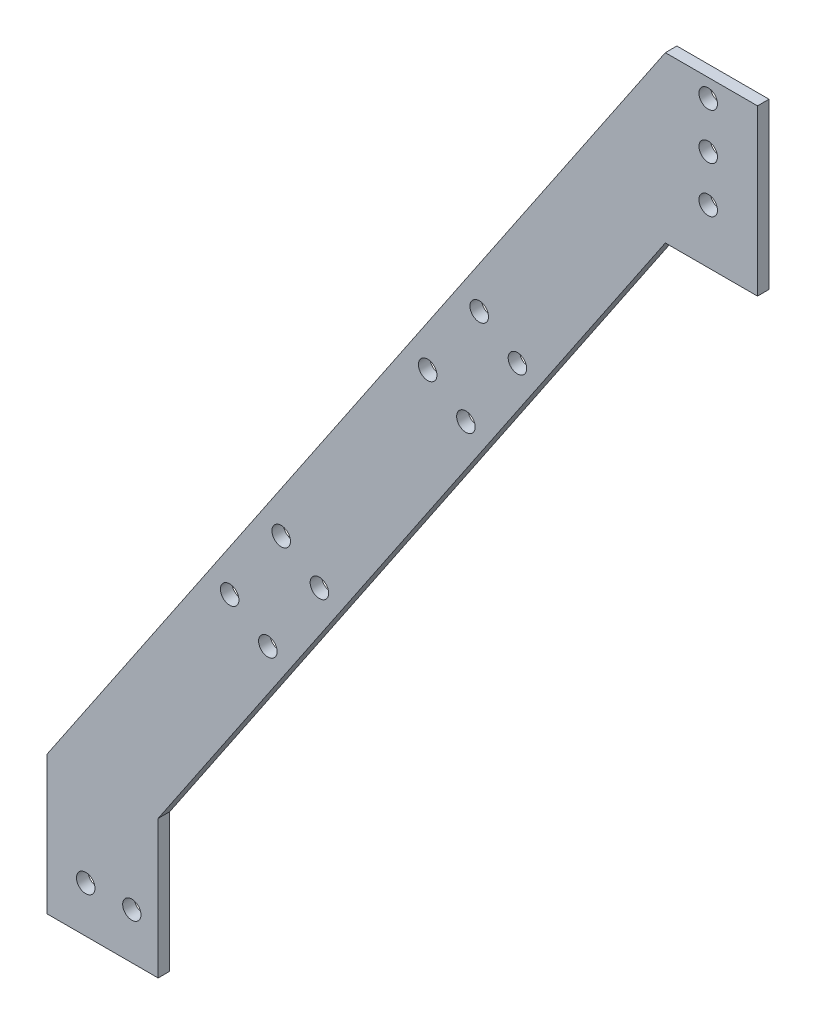
ISO-10303-21;
HEADER;
FILE_DESCRIPTION(('STEP AP214'),'2;1');
FILE_NAME('part.step','',(''),(''),'','','');
FILE_SCHEMA(('AUTOMOTIVE_DESIGN { 1 0 10303 214 1 1 1 1 }'));
ENDSEC;
DATA;
#1=APPLICATION_CONTEXT('core data for automotive mechanical design processes');
#2=APPLICATION_PROTOCOL_DEFINITION('international standard','automotive_design',2000,#1);
#3=PRODUCT_CONTEXT('',#1,'mechanical');
#4=PRODUCT('Part','Part','',(#3));
#5=PRODUCT_RELATED_PRODUCT_CATEGORY('part','',(#4));
#6=PRODUCT_DEFINITION_FORMATION('','',#4);
#7=PRODUCT_DEFINITION_CONTEXT('part definition',#1,'design');
#8=PRODUCT_DEFINITION('design','',#6,#7);
#9=PRODUCT_DEFINITION_SHAPE('','',#8);
#10=(LENGTH_UNIT() NAMED_UNIT(*) SI_UNIT(.MILLI.,.METRE.));
#11=(NAMED_UNIT(*) PLANE_ANGLE_UNIT() SI_UNIT($,.RADIAN.));
#12=(NAMED_UNIT(*) SI_UNIT($,.STERADIAN.) SOLID_ANGLE_UNIT());
#13=UNCERTAINTY_MEASURE_WITH_UNIT(LENGTH_MEASURE(1.E-05),#10,'distance_accuracy_value','');
#14=(GEOMETRIC_REPRESENTATION_CONTEXT(3) GLOBAL_UNCERTAINTY_ASSIGNED_CONTEXT((#13)) GLOBAL_UNIT_ASSIGNED_CONTEXT((#10,
#11,#12)) REPRESENTATION_CONTEXT('',''));
#15=CARTESIAN_POINT('',(0.,0.,0.));
#16=DIRECTION('',(0.,0.,1.));
#17=DIRECTION('',(1.,0.,0.));
#18=AXIS2_PLACEMENT_3D('',#15,#16,#17);
#19=CARTESIAN_POINT('',(30.6379358919992,0.,3.175));
#20=DIRECTION('',(0.,1.,0.));
#21=DIRECTION('',(0.,0.,1.));
#22=AXIS2_PLACEMENT_3D('',#19,#20,#21);
#23=PLANE('',#22);
#24=DIRECTION('',(1.,0.,0.));
#25=VECTOR('',#24,1.);
#26=CARTESIAN_POINT('',(30.6379358919992,0.,0.));
#27=LINE('',#26,#25);
#28=CARTESIAN_POINT('',(0.,0.,0.));
#29=VERTEX_POINT('',#28);
#30=CARTESIAN_POINT('',(30.6379358919992,0.,0.));
#31=VERTEX_POINT('',#30);
#32=EDGE_CURVE('E129',#29,#31,#27,.T.);
#33=ORIENTED_EDGE('',*,*,#32,.T.);
#34=DIRECTION('',(0.,0.,-1.));
#35=VECTOR('',#34,1.);
#36=CARTESIAN_POINT('',(30.6379358919992,0.,3.175));
#37=LINE('',#36,#35);
#38=CARTESIAN_POINT('',(30.6379358919992,0.,3.175));
#39=VERTEX_POINT('',#38);
#40=EDGE_CURVE('E11',#39,#31,#37,.T.);
#41=ORIENTED_EDGE('',*,*,#40,.F.);
#42=DIRECTION('',(1.,0.,0.));
#43=VECTOR('',#42,1.);
#44=CARTESIAN_POINT('',(30.6379358919992,0.,3.175));
#45=LINE('',#44,#43);
#46=CARTESIAN_POINT('',(0.,0.,3.175));
#47=VERTEX_POINT('',#46);
#48=EDGE_CURVE('E144',#47,#39,#45,.T.);
#49=ORIENTED_EDGE('',*,*,#48,.F.);
#50=DIRECTION('',(0.,0.,-1.));
#51=VECTOR('',#50,1.);
#52=CARTESIAN_POINT('',(0.,0.,3.175));
#53=LINE('',#52,#51);
#54=EDGE_CURVE('E125',#47,#29,#53,.T.);
#55=ORIENTED_EDGE('',*,*,#54,.T.);
#56=EDGE_LOOP('',(#33,#41,#49,#55));
#57=FACE_BOUND('',#56,.T.);
#58=ADVANCED_FACE('F33',(#57),#23,.F.);
#59=CARTESIAN_POINT('',(30.6379358919992,38.1,3.175));
#60=DIRECTION('',(-1.,0.,0.));
#61=DIRECTION('',(0.,-1.,0.));
#62=AXIS2_PLACEMENT_3D('',#59,#60,#61);
#63=PLANE('',#62);
#64=DIRECTION('',(0.,1.,0.));
#65=VECTOR('',#64,1.);
#66=CARTESIAN_POINT('',(30.6379358919992,38.1,0.));
#67=LINE('',#66,#65);
#68=CARTESIAN_POINT('',(30.6379358919992,38.1,0.));
#69=VERTEX_POINT('',#68);
#70=EDGE_CURVE('E132',#31,#69,#67,.T.);
#71=ORIENTED_EDGE('',*,*,#70,.T.);
#72=DIRECTION('',(0.,0.,-1.));
#73=VECTOR('',#72,1.);
#74=CARTESIAN_POINT('',(30.6379358919992,38.1,3.175));
#75=LINE('',#74,#73);
#76=CARTESIAN_POINT('',(30.6379358919992,38.1,3.175));
#77=VERTEX_POINT('',#76);
#78=EDGE_CURVE('E41',#77,#69,#75,.T.);
#79=ORIENTED_EDGE('',*,*,#78,.F.);
#80=DIRECTION('',(0.,1.,0.));
#81=VECTOR('',#80,1.);
#82=CARTESIAN_POINT('',(30.6379358919992,38.1,3.175));
#83=LINE('',#82,#81);
#84=EDGE_CURVE('E92',#39,#77,#83,.T.);
#85=ORIENTED_EDGE('',*,*,#84,.F.);
#86=ORIENTED_EDGE('',*,*,#40,.T.);
#87=EDGE_LOOP('',(#71,#79,#85,#86));
#88=FACE_BOUND('',#87,.T.);
#89=ADVANCED_FACE('F303',(#88),#63,.F.);
#90=CARTESIAN_POINT('',(170.441996977884,245.368044205503,3.175));
#91=DIRECTION('',(-0.829037572555041,0.559192903470748,0.));
#92=DIRECTION('',(-0.559192903470748,-0.829037572555041,0.));
#93=AXIS2_PLACEMENT_3D('',#90,#91,#92);
#94=PLANE('',#93);
#95=DIRECTION('',(0.559192903470748,0.829037572555041,0.));
#96=VECTOR('',#95,1.);
#97=CARTESIAN_POINT('',(170.441996977884,245.368044205503,0.));
#98=LINE('',#97,#96);
#99=CARTESIAN_POINT('',(170.441996977884,245.368044205503,0.));
#100=VERTEX_POINT('',#99);
#101=EDGE_CURVE('E135',#69,#100,#98,.T.);
#102=ORIENTED_EDGE('',*,*,#101,.T.);
#103=DIRECTION('',(0.,0.,-1.));
#104=VECTOR('',#103,1.);
#105=CARTESIAN_POINT('',(170.441996977884,245.368044205503,3.175));
#106=LINE('',#105,#104);
#107=CARTESIAN_POINT('',(170.441996977884,245.368044205503,3.175));
#108=VERTEX_POINT('',#107);
#109=EDGE_CURVE('E151',#108,#100,#106,.T.);
#110=ORIENTED_EDGE('',*,*,#109,.F.);
#111=DIRECTION('',(0.559192903470748,0.829037572555041,0.));
#112=VECTOR('',#111,1.);
#113=CARTESIAN_POINT('',(170.441996977884,245.368044205503,3.175));
#114=LINE('',#113,#112);
#115=EDGE_CURVE('E159',#77,#108,#114,.T.);
#116=ORIENTED_EDGE('',*,*,#115,.F.);
#117=ORIENTED_EDGE('',*,*,#78,.T.);
#118=EDGE_LOOP('',(#102,#110,#116,#117));
#119=FACE_BOUND('',#118,.T.);
#120=ADVANCED_FACE('F157',(#119),#94,.F.);
#121=CARTESIAN_POINT('',(195.841996977884,245.368044205503,3.175));
#122=DIRECTION('',(0.,1.,0.));
#123=DIRECTION('',(-1.,0.,0.));
#124=AXIS2_PLACEMENT_3D('',#121,#122,#123);
#125=PLANE('',#124);
#126=DIRECTION('',(1.,0.,0.));
#127=VECTOR('',#126,1.);
#128=CARTESIAN_POINT('',(195.841996977884,245.368044205503,0.));
#129=LINE('',#128,#127);
#130=CARTESIAN_POINT('',(195.841996977884,245.368044205503,0.));
#131=VERTEX_POINT('',#130);
#132=EDGE_CURVE('E137',#100,#131,#129,.T.);
#133=ORIENTED_EDGE('',*,*,#132,.T.);
#134=DIRECTION('',(0.,0.,-1.));
#135=VECTOR('',#134,1.);
#136=CARTESIAN_POINT('',(195.841996977884,245.368044205503,3.175));
#137=LINE('',#136,#135);
#138=CARTESIAN_POINT('',(195.841996977884,245.368044205503,3.175));
#139=VERTEX_POINT('',#138);
#140=EDGE_CURVE('E148',#139,#131,#137,.T.);
#141=ORIENTED_EDGE('',*,*,#140,.F.);
#142=DIRECTION('',(1.,0.,0.));
#143=VECTOR('',#142,1.);
#144=CARTESIAN_POINT('',(195.841996977884,245.368044205503,3.175));
#145=LINE('',#144,#143);
#146=EDGE_CURVE('E171',#108,#139,#145,.T.);
#147=ORIENTED_EDGE('',*,*,#146,.F.);
#148=ORIENTED_EDGE('',*,*,#109,.T.);
#149=EDGE_LOOP('',(#133,#141,#147,#148));
#150=FACE_BOUND('',#149,.T.);
#151=ADVANCED_FACE('F167',(#150),#125,.F.);
#152=CARTESIAN_POINT('',(195.841996977884,290.790652114777,3.175));
#153=DIRECTION('',(-1.,0.,0.));
#154=DIRECTION('',(0.,0.,1.));
#155=AXIS2_PLACEMENT_3D('',#152,#153,#154);
#156=PLANE('',#155);
#157=DIRECTION('',(0.,1.,0.));
#158=VECTOR('',#157,1.);
#159=CARTESIAN_POINT('',(195.841996977884,290.790652114777,0.));
#160=LINE('',#159,#158);
#161=CARTESIAN_POINT('',(195.841996977884,290.790652114777,0.));
#162=VERTEX_POINT('',#161);
#163=EDGE_CURVE('E139',#131,#162,#160,.T.);
#164=ORIENTED_EDGE('',*,*,#163,.T.);
#165=DIRECTION('',(0.,0.,-1.));
#166=VECTOR('',#165,1.);
#167=CARTESIAN_POINT('',(195.841996977884,290.790652114777,3.175));
#168=LINE('',#167,#166);
#169=CARTESIAN_POINT('',(195.841996977884,290.790652114777,3.175));
#170=VERTEX_POINT('',#169);
#171=EDGE_CURVE('E120',#170,#162,#168,.T.);
#172=ORIENTED_EDGE('',*,*,#171,.F.);
#173=DIRECTION('',(0.,1.,0.));
#174=VECTOR('',#173,1.);
#175=CARTESIAN_POINT('',(195.841996977884,290.790652114777,3.175));
#176=LINE('',#175,#174);
#177=EDGE_CURVE('E111',#139,#170,#176,.T.);
#178=ORIENTED_EDGE('',*,*,#177,.F.);
#179=ORIENTED_EDGE('',*,*,#140,.T.);
#180=EDGE_LOOP('',(#164,#172,#178,#179));
#181=FACE_BOUND('',#180,.T.);
#182=ADVANCED_FACE('F170',(#181),#156,.F.);
#183=CARTESIAN_POINT('',(170.441996977884,290.790652114777,3.175));
#184=DIRECTION('',(0.,-1.,0.));
#185=DIRECTION('',(0.,0.,-1.));
#186=AXIS2_PLACEMENT_3D('',#183,#184,#185);
#187=PLANE('',#186);
#188=DIRECTION('',(-1.,0.,0.));
#189=VECTOR('',#188,1.);
#190=CARTESIAN_POINT('',(170.441996977884,290.790652114777,0.));
#191=LINE('',#190,#189);
#192=CARTESIAN_POINT('',(170.441996977884,290.790652114777,0.));
#193=VERTEX_POINT('',#192);
#194=EDGE_CURVE('E119',#162,#193,#191,.T.);
#195=ORIENTED_EDGE('',*,*,#194,.T.);
#196=DIRECTION('',(0.,0.,-1.));
#197=VECTOR('',#196,1.);
#198=CARTESIAN_POINT('',(170.441996977884,290.790652114777,3.175));
#199=LINE('',#198,#197);
#200=CARTESIAN_POINT('',(170.441996977884,290.790652114777,3.175));
#201=VERTEX_POINT('',#200);
#202=EDGE_CURVE('E116',#201,#193,#199,.T.);
#203=ORIENTED_EDGE('',*,*,#202,.F.);
#204=DIRECTION('',(-1.,0.,0.));
#205=VECTOR('',#204,1.);
#206=CARTESIAN_POINT('',(170.441996977884,290.790652114777,3.175));
#207=LINE('',#206,#205);
#208=EDGE_CURVE('E105',#170,#201,#207,.T.);
#209=ORIENTED_EDGE('',*,*,#208,.F.);
#210=ORIENTED_EDGE('',*,*,#171,.T.);
#211=EDGE_LOOP('',(#195,#203,#209,#210));
#212=FACE_BOUND('',#211,.T.);
#213=ADVANCED_FACE('F117',(#212),#187,.F.);
#214=CARTESIAN_POINT('',(0.,38.1,3.175));
#215=DIRECTION('',(0.829037572555041,-0.559192903470748,0.));
#216=DIRECTION('',(0.559192903470748,0.829037572555041,0.));
#217=AXIS2_PLACEMENT_3D('',#214,#215,#216);
#218=PLANE('',#217);
#219=DIRECTION('',(-0.559192903470748,-0.829037572555041,0.));
#220=VECTOR('',#219,1.);
#221=CARTESIAN_POINT('',(0.,38.1,0.));
#222=LINE('',#221,#220);
#223=CARTESIAN_POINT('',(0.,38.1,0.));
#224=VERTEX_POINT('',#223);
#225=EDGE_CURVE('E78',#193,#224,#222,.T.);
#226=ORIENTED_EDGE('',*,*,#225,.T.);
#227=DIRECTION('',(0.,0.,-1.));
#228=VECTOR('',#227,1.);
#229=CARTESIAN_POINT('',(0.,38.1,3.175));
#230=LINE('',#229,#228);
#231=CARTESIAN_POINT('',(0.,38.1,3.175));
#232=VERTEX_POINT('',#231);
#233=EDGE_CURVE('E121',#232,#224,#230,.T.);
#234=ORIENTED_EDGE('',*,*,#233,.F.);
#235=DIRECTION('',(-0.559192903470748,-0.829037572555041,0.));
#236=VECTOR('',#235,1.);
#237=CARTESIAN_POINT('',(0.,38.1,3.175));
#238=LINE('',#237,#236);
#239=EDGE_CURVE('E109',#201,#232,#238,.T.);
#240=ORIENTED_EDGE('',*,*,#239,.F.);
#241=ORIENTED_EDGE('',*,*,#202,.T.);
#242=EDGE_LOOP('',(#226,#234,#240,#241));
#243=FACE_BOUND('',#242,.T.);
#244=ADVANCED_FACE('F123',(#243),#218,.F.);
#245=CARTESIAN_POINT('',(0.,0.,3.175));
#246=DIRECTION('',(1.,0.,0.));
#247=DIRECTION('',(0.,0.,-1.));
#248=AXIS2_PLACEMENT_3D('',#245,#246,#247);
#249=PLANE('',#248);
#250=DIRECTION('',(0.,-1.,0.));
#251=VECTOR('',#250,1.);
#252=CARTESIAN_POINT('',(0.,0.,0.));
#253=LINE('',#252,#251);
#254=EDGE_CURVE('E84',#224,#29,#253,.T.);
#255=ORIENTED_EDGE('',*,*,#254,.T.);
#256=ORIENTED_EDGE('',*,*,#54,.F.);
#257=DIRECTION('',(0.,-1.,0.));
#258=VECTOR('',#257,1.);
#259=CARTESIAN_POINT('',(0.,0.,3.175));
#260=LINE('',#259,#258);
#261=EDGE_CURVE('E49',#232,#47,#260,.T.);
#262=ORIENTED_EDGE('',*,*,#261,.F.);
#263=ORIENTED_EDGE('',*,*,#233,.T.);
#264=EDGE_LOOP('',(#255,#256,#262,#263));
#265=FACE_BOUND('',#264,.T.);
#266=ADVANCED_FACE('F267',(#265),#249,.F.);
#267=CARTESIAN_POINT('',(0.,0.,3.175));
#268=DIRECTION('',(0.,0.,-1.));
#269=DIRECTION('',(-1.,0.,0.));
#270=AXIS2_PLACEMENT_3D('',#267,#268,#269);
#271=PLANE('',#270);
#272=CARTESIAN_POINT('',(129.668859021767,196.275033285297,3.175));
#273=DIRECTION('',(0.,0.,1.));
#274=DIRECTION('',(1.,0.,0.));
#275=AXIS2_PLACEMENT_3D('',#272,#273,#274);
#276=CIRCLE('',#275,2.55269999999999);
#277=CARTESIAN_POINT('',(132.221559021767,196.275033285297,3.175));
#278=VERTEX_POINT('',#277);
#279=EDGE_CURVE('E232',#278,#278,#276,.T.);
#280=ORIENTED_EDGE('',*,*,#279,.F.);
#281=EDGE_LOOP('',(#280));
#282=FACE_BOUND('',#281,.T.);
#283=CARTESIAN_POINT('',(119.140081850318,203.376783159376,3.175));
#284=DIRECTION('',(0.,0.,1.));
#285=DIRECTION('',(1.,0.,0.));
#286=AXIS2_PLACEMENT_3D('',#283,#284,#285);
#287=CIRCLE('',#286,2.55270000000003);
#288=CARTESIAN_POINT('',(121.692781850318,203.376783159376,3.175));
#289=VERTEX_POINT('',#288);
#290=EDGE_CURVE('E226',#289,#289,#287,.T.);
#291=ORIENTED_EDGE('',*,*,#290,.F.);
#292=EDGE_LOOP('',(#291));
#293=FACE_BOUND('',#292,.T.);
#294=CARTESIAN_POINT('',(115.46535927361,175.217478942399,3.175));
#295=DIRECTION('',(0.,0.,1.));
#296=DIRECTION('',(1.,0.,0.));
#297=AXIS2_PLACEMENT_3D('',#294,#295,#296);
#298=CIRCLE('',#297,2.55270000000003);
#299=CARTESIAN_POINT('',(118.01805927361,175.217478942399,3.175));
#300=VERTEX_POINT('',#299);
#301=EDGE_CURVE('E220',#300,#300,#298,.T.);
#302=ORIENTED_EDGE('',*,*,#301,.F.);
#303=EDGE_LOOP('',(#302));
#304=FACE_BOUND('',#303,.T.);
#305=CARTESIAN_POINT('',(50.3535195052181,101.396510668363,3.175));
#306=DIRECTION('',(0.,0.,1.));
#307=DIRECTION('',(1.,0.,0.));
#308=AXIS2_PLACEMENT_3D('',#305,#306,#307);
#309=CIRCLE('',#308,2.5527);
#310=CARTESIAN_POINT('',(52.9062195052181,101.396510668363,3.175));
#311=VERTEX_POINT('',#310);
#312=EDGE_CURVE('E213',#311,#311,#309,.T.);
#313=ORIENTED_EDGE('',*,*,#312,.F.);
#314=EDGE_LOOP('',(#313));
#315=FACE_BOUND('',#314,.T.);
#316=CARTESIAN_POINT('',(64.5570192533751,122.454065011261,3.175));
#317=DIRECTION('',(0.,0.,1.));
#318=DIRECTION('',(1.,0.,0.));
#319=AXIS2_PLACEMENT_3D('',#316,#317,#318);
#320=CIRCLE('',#319,2.5527);
#321=CARTESIAN_POINT('',(67.1097192533751,122.454065011261,3.175));
#322=VERTEX_POINT('',#321);
#323=EDGE_CURVE('E249',#322,#322,#320,.T.);
#324=ORIENTED_EDGE('',*,*,#323,.F.);
#325=EDGE_LOOP('',(#324));
#326=FACE_BOUND('',#325,.T.);
#327=CARTESIAN_POINT('',(75.0857964248241,115.352315137182,3.175));
#328=DIRECTION('',(0.,0.,1.));
#329=DIRECTION('',(1.,0.,0.));
#330=AXIS2_PLACEMENT_3D('',#327,#328,#329);
#331=CIRCLE('',#330,2.55270000000003);
#332=CARTESIAN_POINT('',(77.6384964248242,115.352315137182,3.175));
#333=VERTEX_POINT('',#332);
#334=EDGE_CURVE('E243',#333,#333,#331,.T.);
#335=ORIENTED_EDGE('',*,*,#334,.F.);
#336=EDGE_LOOP('',(#335));
#337=FACE_BOUND('',#336,.T.);
#338=CARTESIAN_POINT('',(60.8822966766672,94.2947607942844,3.175));
#339=DIRECTION('',(0.,0.,1.));
#340=DIRECTION('',(1.,0.,0.));
#341=AXIS2_PLACEMENT_3D('',#338,#339,#340);
#342=CIRCLE('',#341,2.5527);
#343=CARTESIAN_POINT('',(63.4349966766671,94.2947607942844,3.175));
#344=VERTEX_POINT('',#343);
#345=EDGE_CURVE('E237',#344,#344,#342,.T.);
#346=ORIENTED_EDGE('',*,*,#345,.F.);
#347=EDGE_LOOP('',(#346));
#348=FACE_BOUND('',#347,.T.);
#349=CARTESIAN_POINT('',(104.936582102161,182.319228816478,3.175));
#350=DIRECTION('',(0.,0.,1.));
#351=DIRECTION('',(1.,0.,0.));
#352=AXIS2_PLACEMENT_3D('',#349,#350,#351);
#353=CIRCLE('',#352,2.55270000000003);
#354=CARTESIAN_POINT('',(107.489282102161,182.319228816478,3.175));
#355=VERTEX_POINT('',#354);
#356=EDGE_CURVE('E207',#355,#355,#353,.T.);
#357=ORIENTED_EDGE('',*,*,#356,.F.);
#358=EDGE_LOOP('',(#357));
#359=FACE_BOUND('',#358,.T.);
#360=CARTESIAN_POINT('',(182.257063517884,285.750000016777,3.175));
#361=DIRECTION('',(0.,0.,1.));
#362=DIRECTION('',(1.,0.,0.));
#363=AXIS2_PLACEMENT_3D('',#360,#361,#362);
#364=CIRCLE('',#363,2.55269999999998);
#365=CARTESIAN_POINT('',(184.809763517884,285.750000016777,3.175));
#366=VERTEX_POINT('',#365);
#367=EDGE_CURVE('E190',#366,#366,#364,.T.);
#368=ORIENTED_EDGE('',*,*,#367,.F.);
#369=EDGE_LOOP('',(#368));
#370=FACE_BOUND('',#369,.T.);
#371=CARTESIAN_POINT('',(182.257063517884,260.350000016777,3.175));
#372=DIRECTION('',(0.,0.,1.));
#373=DIRECTION('',(1.,0.,0.));
#374=AXIS2_PLACEMENT_3D('',#371,#372,#373);
#375=CIRCLE('',#374,2.55269999999998);
#376=CARTESIAN_POINT('',(184.809763517884,260.350000016777,3.175));
#377=VERTEX_POINT('',#376);
#378=EDGE_CURVE('E191',#377,#377,#375,.T.);
#379=ORIENTED_EDGE('',*,*,#378,.F.);
#380=EDGE_LOOP('',(#379));
#381=FACE_BOUND('',#380,.T.);
#382=CARTESIAN_POINT('',(10.680063476,12.7,3.175));
#383=DIRECTION('',(0.,0.,1.));
#384=DIRECTION('',(1.,0.,0.));
#385=AXIS2_PLACEMENT_3D('',#382,#383,#384);
#386=CIRCLE('',#385,2.55269999999997);
#387=CARTESIAN_POINT('',(13.232763476,12.7,3.175));
#388=VERTEX_POINT('',#387);
#389=EDGE_CURVE('E198',#388,#388,#386,.T.);
#390=ORIENTED_EDGE('',*,*,#389,.F.);
#391=EDGE_LOOP('',(#390));
#392=FACE_BOUND('',#391,.T.);
#393=CARTESIAN_POINT('',(23.380063476,12.7,3.175));
#394=DIRECTION('',(0.,0.,1.));
#395=DIRECTION('',(1.,0.,0.));
#396=AXIS2_PLACEMENT_3D('',#393,#394,#395);
#397=CIRCLE('',#396,2.5223589264469);
#398=CARTESIAN_POINT('',(25.9024224024469,12.7,3.175));
#399=VERTEX_POINT('',#398);
#400=EDGE_CURVE('E177',#399,#399,#397,.T.);
#401=ORIENTED_EDGE('',*,*,#400,.F.);
#402=EDGE_LOOP('',(#401));
#403=FACE_BOUND('',#402,.T.);
#404=CARTESIAN_POINT('',(182.257063517884,273.050000016777,3.175));
#405=DIRECTION('',(0.,0.,1.));
#406=DIRECTION('',(1.,0.,0.));
#407=AXIS2_PLACEMENT_3D('',#404,#405,#406);
#408=CIRCLE('',#407,2.55269999999998);
#409=CARTESIAN_POINT('',(184.809763517884,273.050000016777,3.175));
#410=VERTEX_POINT('',#409);
#411=EDGE_CURVE('E184',#410,#410,#408,.T.);
#412=ORIENTED_EDGE('',*,*,#411,.F.);
#413=EDGE_LOOP('',(#412));
#414=FACE_BOUND('',#413,.T.);
#415=ORIENTED_EDGE('',*,*,#48,.T.);
#416=ORIENTED_EDGE('',*,*,#84,.T.);
#417=ORIENTED_EDGE('',*,*,#115,.T.);
#418=ORIENTED_EDGE('',*,*,#146,.T.);
#419=ORIENTED_EDGE('',*,*,#177,.T.);
#420=ORIENTED_EDGE('',*,*,#208,.T.);
#421=ORIENTED_EDGE('',*,*,#239,.T.);
#422=ORIENTED_EDGE('',*,*,#261,.T.);
#423=EDGE_LOOP('',(#415,#416,#417,#418,#419,#420,#421,#422));
#424=FACE_BOUND('',#423,.T.);
#425=ADVANCED_FACE('F107',(#282,#293,#304,#315,#326,#337,#348,#359,#370,#381,#392,#403,#414,
#424),#271,.F.);
#426=CARTESIAN_POINT('',(0.,0.,0.));
#427=DIRECTION('',(0.,0.,-1.));
#428=DIRECTION('',(-1.,0.,0.));
#429=AXIS2_PLACEMENT_3D('',#426,#427,#428);
#430=PLANE('',#429);
#431=CARTESIAN_POINT('',(129.668859021767,196.275033285297,0.));
#432=DIRECTION('',(0.,0.,1.));
#433=DIRECTION('',(1.,0.,0.));
#434=AXIS2_PLACEMENT_3D('',#431,#432,#433);
#435=CIRCLE('',#434,2.55269999999999);
#436=CARTESIAN_POINT('',(132.221559021767,196.275033285297,0.));
#437=VERTEX_POINT('',#436);
#438=EDGE_CURVE('E210',#437,#437,#435,.T.);
#439=ORIENTED_EDGE('',*,*,#438,.T.);
#440=EDGE_LOOP('',(#439));
#441=FACE_BOUND('',#440,.T.);
#442=CARTESIAN_POINT('',(119.140081850318,203.376783159376,0.));
#443=DIRECTION('',(0.,0.,1.));
#444=DIRECTION('',(1.,0.,0.));
#445=AXIS2_PLACEMENT_3D('',#442,#443,#444);
#446=CIRCLE('',#445,2.55270000000003);
#447=CARTESIAN_POINT('',(121.692781850318,203.376783159376,0.));
#448=VERTEX_POINT('',#447);
#449=EDGE_CURVE('E229',#448,#448,#446,.T.);
#450=ORIENTED_EDGE('',*,*,#449,.T.);
#451=EDGE_LOOP('',(#450));
#452=FACE_BOUND('',#451,.T.);
#453=CARTESIAN_POINT('',(115.46535927361,175.217478942399,0.));
#454=DIRECTION('',(0.,0.,1.));
#455=DIRECTION('',(1.,0.,0.));
#456=AXIS2_PLACEMENT_3D('',#453,#454,#455);
#457=CIRCLE('',#456,2.55270000000003);
#458=CARTESIAN_POINT('',(118.01805927361,175.217478942399,0.));
#459=VERTEX_POINT('',#458);
#460=EDGE_CURVE('E223',#459,#459,#457,.T.);
#461=ORIENTED_EDGE('',*,*,#460,.T.);
#462=EDGE_LOOP('',(#461));
#463=FACE_BOUND('',#462,.T.);
#464=CARTESIAN_POINT('',(50.3535195052181,101.396510668363,0.));
#465=DIRECTION('',(0.,0.,1.));
#466=DIRECTION('',(1.,0.,0.));
#467=AXIS2_PLACEMENT_3D('',#464,#465,#466);
#468=CIRCLE('',#467,2.5527);
#469=CARTESIAN_POINT('',(52.9062195052181,101.396510668363,0.));
#470=VERTEX_POINT('',#469);
#471=EDGE_CURVE('E216',#470,#470,#468,.T.);
#472=ORIENTED_EDGE('',*,*,#471,.T.);
#473=EDGE_LOOP('',(#472));
#474=FACE_BOUND('',#473,.T.);
#475=CARTESIAN_POINT('',(64.5570192533751,122.454065011261,0.));
#476=DIRECTION('',(0.,0.,1.));
#477=DIRECTION('',(1.,0.,0.));
#478=AXIS2_PLACEMENT_3D('',#475,#476,#477);
#479=CIRCLE('',#478,2.5527);
#480=CARTESIAN_POINT('',(67.1097192533751,122.454065011261,0.));
#481=VERTEX_POINT('',#480);
#482=EDGE_CURVE('E217',#481,#481,#479,.T.);
#483=ORIENTED_EDGE('',*,*,#482,.T.);
#484=EDGE_LOOP('',(#483));
#485=FACE_BOUND('',#484,.T.);
#486=CARTESIAN_POINT('',(75.0857964248241,115.352315137182,0.));
#487=DIRECTION('',(0.,0.,1.));
#488=DIRECTION('',(1.,0.,0.));
#489=AXIS2_PLACEMENT_3D('',#486,#487,#488);
#490=CIRCLE('',#489,2.55270000000003);
#491=CARTESIAN_POINT('',(77.6384964248242,115.352315137182,0.));
#492=VERTEX_POINT('',#491);
#493=EDGE_CURVE('E246',#492,#492,#490,.T.);
#494=ORIENTED_EDGE('',*,*,#493,.T.);
#495=EDGE_LOOP('',(#494));
#496=FACE_BOUND('',#495,.T.);
#497=CARTESIAN_POINT('',(60.8822966766672,94.2947607942844,0.));
#498=DIRECTION('',(0.,0.,1.));
#499=DIRECTION('',(1.,0.,0.));
#500=AXIS2_PLACEMENT_3D('',#497,#498,#499);
#501=CIRCLE('',#500,2.5527);
#502=CARTESIAN_POINT('',(63.4349966766671,94.2947607942844,0.));
#503=VERTEX_POINT('',#502);
#504=EDGE_CURVE('E240',#503,#503,#501,.T.);
#505=ORIENTED_EDGE('',*,*,#504,.T.);
#506=EDGE_LOOP('',(#505));
#507=FACE_BOUND('',#506,.T.);
#508=CARTESIAN_POINT('',(104.936582102161,182.319228816478,0.));
#509=DIRECTION('',(0.,0.,1.));
#510=DIRECTION('',(1.,0.,0.));
#511=AXIS2_PLACEMENT_3D('',#508,#509,#510);
#512=CIRCLE('',#511,2.55270000000003);
#513=CARTESIAN_POINT('',(107.489282102161,182.319228816478,0.));
#514=VERTEX_POINT('',#513);
#515=EDGE_CURVE('E195',#514,#514,#512,.T.);
#516=ORIENTED_EDGE('',*,*,#515,.T.);
#517=EDGE_LOOP('',(#516));
#518=FACE_BOUND('',#517,.T.);
#519=CARTESIAN_POINT('',(182.257063517884,285.750000016777,0.));
#520=DIRECTION('',(0.,0.,1.));
#521=DIRECTION('',(1.,0.,0.));
#522=AXIS2_PLACEMENT_3D('',#519,#520,#521);
#523=CIRCLE('',#522,2.55269999999998);
#524=CARTESIAN_POINT('',(184.809763517884,285.750000016777,0.));
#525=VERTEX_POINT('',#524);
#526=EDGE_CURVE('E133',#525,#525,#523,.T.);
#527=ORIENTED_EDGE('',*,*,#526,.T.);
#528=EDGE_LOOP('',(#527));
#529=FACE_BOUND('',#528,.T.);
#530=CARTESIAN_POINT('',(182.257063517884,260.350000016777,0.));
#531=DIRECTION('',(0.,0.,1.));
#532=DIRECTION('',(1.,0.,0.));
#533=AXIS2_PLACEMENT_3D('',#530,#531,#532);
#534=CIRCLE('',#533,2.55269999999998);
#535=CARTESIAN_POINT('',(184.809763517884,260.350000016777,0.));
#536=VERTEX_POINT('',#535);
#537=EDGE_CURVE('E194',#536,#536,#534,.T.);
#538=ORIENTED_EDGE('',*,*,#537,.T.);
#539=EDGE_LOOP('',(#538));
#540=FACE_BOUND('',#539,.T.);
#541=CARTESIAN_POINT('',(10.680063476,12.7,0.));
#542=DIRECTION('',(0.,0.,1.));
#543=DIRECTION('',(1.,0.,0.));
#544=AXIS2_PLACEMENT_3D('',#541,#542,#543);
#545=CIRCLE('',#544,2.55269999999997);
#546=CARTESIAN_POINT('',(13.232763476,12.7,0.));
#547=VERTEX_POINT('',#546);
#548=EDGE_CURVE('E181',#547,#547,#545,.T.);
#549=ORIENTED_EDGE('',*,*,#548,.T.);
#550=EDGE_LOOP('',(#549));
#551=FACE_BOUND('',#550,.T.);
#552=CARTESIAN_POINT('',(23.380063476,12.7,0.));
#553=DIRECTION('',(0.,0.,1.));
#554=DIRECTION('',(1.,0.,0.));
#555=AXIS2_PLACEMENT_3D('',#552,#553,#554);
#556=CIRCLE('',#555,2.5223589264469);
#557=CARTESIAN_POINT('',(25.9024224024469,12.7,0.));
#558=VERTEX_POINT('',#557);
#559=EDGE_CURVE('E180',#558,#558,#556,.T.);
#560=ORIENTED_EDGE('',*,*,#559,.T.);
#561=EDGE_LOOP('',(#560));
#562=FACE_BOUND('',#561,.T.);
#563=CARTESIAN_POINT('',(182.257063517884,273.050000016777,0.));
#564=DIRECTION('',(0.,0.,1.));
#565=DIRECTION('',(1.,0.,0.));
#566=AXIS2_PLACEMENT_3D('',#563,#564,#565);
#567=CIRCLE('',#566,2.55269999999998);
#568=CARTESIAN_POINT('',(184.809763517884,273.050000016777,0.));
#569=VERTEX_POINT('',#568);
#570=EDGE_CURVE('E187',#569,#569,#567,.T.);
#571=ORIENTED_EDGE('',*,*,#570,.T.);
#572=EDGE_LOOP('',(#571));
#573=FACE_BOUND('',#572,.T.);
#574=ORIENTED_EDGE('',*,*,#32,.F.);
#575=ORIENTED_EDGE('',*,*,#254,.F.);
#576=ORIENTED_EDGE('',*,*,#225,.F.);
#577=ORIENTED_EDGE('',*,*,#194,.F.);
#578=ORIENTED_EDGE('',*,*,#163,.F.);
#579=ORIENTED_EDGE('',*,*,#132,.F.);
#580=ORIENTED_EDGE('',*,*,#101,.F.);
#581=ORIENTED_EDGE('',*,*,#70,.F.);
#582=EDGE_LOOP('',(#574,#575,#576,#577,#578,#579,#580,#581));
#583=FACE_BOUND('',#582,.T.);
#584=ADVANCED_FACE('F163',(#441,#452,#463,#474,#485,#496,#507,#518,#529,#540,#551,#562,#573,
#583),#430,.T.);
#585=CARTESIAN_POINT('',(182.257063517884,273.050000016777,0.));
#586=DIRECTION('',(0.,0.,1.));
#587=DIRECTION('',(1.,0.,0.));
#588=AXIS2_PLACEMENT_3D('',#585,#586,#587);
#589=CYLINDRICAL_SURFACE('',#588,2.55269999999998);
#590=ORIENTED_EDGE('',*,*,#570,.F.);
#591=EDGE_LOOP('',(#590));
#592=FACE_BOUND('',#591,.T.);
#593=ORIENTED_EDGE('',*,*,#411,.T.);
#594=EDGE_LOOP('',(#593));
#595=FACE_BOUND('',#594,.T.);
#596=ADVANCED_FACE('F286',(#592,#595),#589,.F.);
#597=CARTESIAN_POINT('',(23.380063476,12.7,0.));
#598=DIRECTION('',(0.,0.,1.));
#599=DIRECTION('',(1.,0.,0.));
#600=AXIS2_PLACEMENT_3D('',#597,#598,#599);
#601=CYLINDRICAL_SURFACE('',#600,2.5223589264469);
#602=ORIENTED_EDGE('',*,*,#559,.F.);
#603=EDGE_LOOP('',(#602));
#604=FACE_BOUND('',#603,.T.);
#605=ORIENTED_EDGE('',*,*,#400,.T.);
#606=EDGE_LOOP('',(#605));
#607=FACE_BOUND('',#606,.T.);
#608=ADVANCED_FACE('F288',(#604,#607),#601,.F.);
#609=CARTESIAN_POINT('',(10.680063476,12.7,0.));
#610=DIRECTION('',(0.,0.,1.));
#611=DIRECTION('',(1.,0.,0.));
#612=AXIS2_PLACEMENT_3D('',#609,#610,#611);
#613=CYLINDRICAL_SURFACE('',#612,2.55269999999997);
#614=ORIENTED_EDGE('',*,*,#548,.F.);
#615=EDGE_LOOP('',(#614));
#616=FACE_BOUND('',#615,.T.);
#617=ORIENTED_EDGE('',*,*,#389,.T.);
#618=EDGE_LOOP('',(#617));
#619=FACE_BOUND('',#618,.T.);
#620=ADVANCED_FACE('F295',(#616,#619),#613,.F.);
#621=CARTESIAN_POINT('',(182.257063517884,260.350000016777,0.));
#622=DIRECTION('',(0.,0.,1.));
#623=DIRECTION('',(1.,0.,0.));
#624=AXIS2_PLACEMENT_3D('',#621,#622,#623);
#625=CYLINDRICAL_SURFACE('',#624,2.55269999999998);
#626=ORIENTED_EDGE('',*,*,#537,.F.);
#627=EDGE_LOOP('',(#626));
#628=FACE_BOUND('',#627,.T.);
#629=ORIENTED_EDGE('',*,*,#378,.T.);
#630=EDGE_LOOP('',(#629));
#631=FACE_BOUND('',#630,.T.);
#632=ADVANCED_FACE('F369',(#628,#631),#625,.F.);
#633=CARTESIAN_POINT('',(182.257063517884,285.750000016777,0.));
#634=DIRECTION('',(0.,0.,1.));
#635=DIRECTION('',(1.,0.,0.));
#636=AXIS2_PLACEMENT_3D('',#633,#634,#635);
#637=CYLINDRICAL_SURFACE('',#636,2.55269999999998);
#638=ORIENTED_EDGE('',*,*,#526,.F.);
#639=EDGE_LOOP('',(#638));
#640=FACE_BOUND('',#639,.T.);
#641=ORIENTED_EDGE('',*,*,#367,.T.);
#642=EDGE_LOOP('',(#641));
#643=FACE_BOUND('',#642,.T.);
#644=ADVANCED_FACE('F379',(#640,#643),#637,.F.);
#645=CARTESIAN_POINT('',(104.936582102161,182.319228816478,0.));
#646=DIRECTION('',(0.,0.,1.));
#647=DIRECTION('',(1.,0.,0.));
#648=AXIS2_PLACEMENT_3D('',#645,#646,#647);
#649=CYLINDRICAL_SURFACE('',#648,2.55270000000003);
#650=ORIENTED_EDGE('',*,*,#515,.F.);
#651=EDGE_LOOP('',(#650));
#652=FACE_BOUND('',#651,.T.);
#653=ORIENTED_EDGE('',*,*,#356,.T.);
#654=EDGE_LOOP('',(#653));
#655=FACE_BOUND('',#654,.T.);
#656=ADVANCED_FACE('F388',(#652,#655),#649,.F.);
#657=CARTESIAN_POINT('',(60.8822966766672,94.2947607942844,0.));
#658=DIRECTION('',(0.,0.,1.));
#659=DIRECTION('',(1.,0.,0.));
#660=AXIS2_PLACEMENT_3D('',#657,#658,#659);
#661=CYLINDRICAL_SURFACE('',#660,2.5527);
#662=ORIENTED_EDGE('',*,*,#504,.F.);
#663=EDGE_LOOP('',(#662));
#664=FACE_BOUND('',#663,.T.);
#665=ORIENTED_EDGE('',*,*,#345,.T.);
#666=EDGE_LOOP('',(#665));
#667=FACE_BOUND('',#666,.T.);
#668=ADVANCED_FACE('F408',(#664,#667),#661,.F.);
#669=CARTESIAN_POINT('',(75.0857964248241,115.352315137182,0.));
#670=DIRECTION('',(0.,0.,1.));
#671=DIRECTION('',(1.,0.,0.));
#672=AXIS2_PLACEMENT_3D('',#669,#670,#671);
#673=CYLINDRICAL_SURFACE('',#672,2.55270000000003);
#674=ORIENTED_EDGE('',*,*,#493,.F.);
#675=EDGE_LOOP('',(#674));
#676=FACE_BOUND('',#675,.T.);
#677=ORIENTED_EDGE('',*,*,#334,.T.);
#678=EDGE_LOOP('',(#677));
#679=FACE_BOUND('',#678,.T.);
#680=ADVANCED_FACE('F261',(#676,#679),#673,.F.);
#681=CARTESIAN_POINT('',(64.5570192533751,122.454065011261,0.));
#682=DIRECTION('',(0.,0.,1.));
#683=DIRECTION('',(1.,0.,0.));
#684=AXIS2_PLACEMENT_3D('',#681,#682,#683);
#685=CYLINDRICAL_SURFACE('',#684,2.5527);
#686=ORIENTED_EDGE('',*,*,#482,.F.);
#687=EDGE_LOOP('',(#686));
#688=FACE_BOUND('',#687,.T.);
#689=ORIENTED_EDGE('',*,*,#323,.T.);
#690=EDGE_LOOP('',(#689));
#691=FACE_BOUND('',#690,.T.);
#692=ADVANCED_FACE('F257',(#688,#691),#685,.F.);
#693=CARTESIAN_POINT('',(50.3535195052181,101.396510668363,0.));
#694=DIRECTION('',(0.,0.,1.));
#695=DIRECTION('',(1.,0.,0.));
#696=AXIS2_PLACEMENT_3D('',#693,#694,#695);
#697=CYLINDRICAL_SURFACE('',#696,2.5527);
#698=ORIENTED_EDGE('',*,*,#471,.F.);
#699=EDGE_LOOP('',(#698));
#700=FACE_BOUND('',#699,.T.);
#701=ORIENTED_EDGE('',*,*,#312,.T.);
#702=EDGE_LOOP('',(#701));
#703=FACE_BOUND('',#702,.T.);
#704=ADVANCED_FACE('F260',(#700,#703),#697,.F.);
#705=CARTESIAN_POINT('',(115.46535927361,175.217478942399,0.));
#706=DIRECTION('',(0.,0.,1.));
#707=DIRECTION('',(1.,0.,0.));
#708=AXIS2_PLACEMENT_3D('',#705,#706,#707);
#709=CYLINDRICAL_SURFACE('',#708,2.55270000000003);
#710=ORIENTED_EDGE('',*,*,#460,.F.);
#711=EDGE_LOOP('',(#710));
#712=FACE_BOUND('',#711,.T.);
#713=ORIENTED_EDGE('',*,*,#301,.T.);
#714=EDGE_LOOP('',(#713));
#715=FACE_BOUND('',#714,.T.);
#716=ADVANCED_FACE('F442',(#712,#715),#709,.F.);
#717=CARTESIAN_POINT('',(119.140081850318,203.376783159376,0.));
#718=DIRECTION('',(0.,0.,1.));
#719=DIRECTION('',(1.,0.,0.));
#720=AXIS2_PLACEMENT_3D('',#717,#718,#719);
#721=CYLINDRICAL_SURFACE('',#720,2.55270000000003);
#722=ORIENTED_EDGE('',*,*,#449,.F.);
#723=EDGE_LOOP('',(#722));
#724=FACE_BOUND('',#723,.T.);
#725=ORIENTED_EDGE('',*,*,#290,.T.);
#726=EDGE_LOOP('',(#725));
#727=FACE_BOUND('',#726,.T.);
#728=ADVANCED_FACE('F452',(#724,#727),#721,.F.);
#729=CARTESIAN_POINT('',(129.668859021767,196.275033285297,0.));
#730=DIRECTION('',(0.,0.,1.));
#731=DIRECTION('',(1.,0.,0.));
#732=AXIS2_PLACEMENT_3D('',#729,#730,#731);
#733=CYLINDRICAL_SURFACE('',#732,2.55269999999999);
#734=ORIENTED_EDGE('',*,*,#438,.F.);
#735=EDGE_LOOP('',(#734));
#736=FACE_BOUND('',#735,.T.);
#737=ORIENTED_EDGE('',*,*,#279,.T.);
#738=EDGE_LOOP('',(#737));
#739=FACE_BOUND('',#738,.T.);
#740=ADVANCED_FACE('F462',(#736,#739),#733,.F.);
#741=CLOSED_SHELL('',(#58,#89,#120,#151,#182,#213,#244,#266,#425,#584,#596,#608,#620,#632,#644,
#656,#668,#680,#692,#704,#716,#728,#740));
#742=MANIFOLD_SOLID_BREP('B2',#741);
#743=ADVANCED_BREP_SHAPE_REPRESENTATION('',(#18,#742),#14);
#744=SHAPE_DEFINITION_REPRESENTATION(#9,#743);
ENDSEC;
END-ISO-10303-21;
